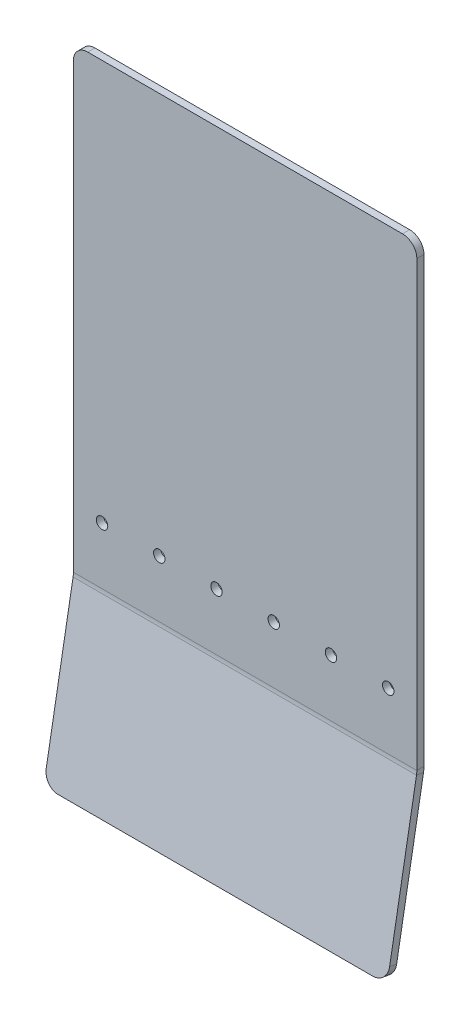
ISO-10303-21;
HEADER;
FILE_DESCRIPTION(('STEP AP214'),'2;1');
FILE_NAME('part.step','',(''),(''),'','','');
FILE_SCHEMA(('AUTOMOTIVE_DESIGN { 1 0 10303 214 1 1 1 1 }'));
ENDSEC;
DATA;
#1=APPLICATION_CONTEXT('core data for automotive mechanical design processes');
#2=APPLICATION_PROTOCOL_DEFINITION('international standard','automotive_design',2000,#1);
#3=PRODUCT_CONTEXT('',#1,'mechanical');
#4=PRODUCT('Part','Part','',(#3));
#5=PRODUCT_RELATED_PRODUCT_CATEGORY('part','',(#4));
#6=PRODUCT_DEFINITION_FORMATION('','',#4);
#7=PRODUCT_DEFINITION_CONTEXT('part definition',#1,'design');
#8=PRODUCT_DEFINITION('design','',#6,#7);
#9=PRODUCT_DEFINITION_SHAPE('','',#8);
#10=(LENGTH_UNIT() NAMED_UNIT(*) SI_UNIT(.MILLI.,.METRE.));
#11=(NAMED_UNIT(*) PLANE_ANGLE_UNIT() SI_UNIT($,.RADIAN.));
#12=(NAMED_UNIT(*) SI_UNIT($,.STERADIAN.) SOLID_ANGLE_UNIT());
#13=UNCERTAINTY_MEASURE_WITH_UNIT(LENGTH_MEASURE(1.E-05),#10,'distance_accuracy_value','');
#14=(GEOMETRIC_REPRESENTATION_CONTEXT(3) GLOBAL_UNCERTAINTY_ASSIGNED_CONTEXT((#13)) GLOBAL_UNIT_ASSIGNED_CONTEXT((#10,
#11,#12)) REPRESENTATION_CONTEXT('',''));
#15=CARTESIAN_POINT('',(0.,0.,0.));
#16=DIRECTION('',(0.,0.,1.));
#17=DIRECTION('',(1.,0.,0.));
#18=AXIS2_PLACEMENT_3D('',#15,#16,#17);
#19=CARTESIAN_POINT('',(152.4,0.,3.175));
#20=DIRECTION('',(-1.,0.,0.));
#21=DIRECTION('',(0.,1.,0.));
#22=AXIS2_PLACEMENT_3D('',#19,#20,#21);
#23=PLANE('',#22);
#24=DIRECTION('',(0.,1.,0.));
#25=VECTOR('',#24,1.);
#26=CARTESIAN_POINT('',(152.4,0.,3.175));
#27=LINE('',#26,#25);
#28=CARTESIAN_POINT('',(152.4,19.1589829192409,3.17500000000003));
#29=VERTEX_POINT('',#28);
#30=CARTESIAN_POINT('',(152.4,215.9,3.175));
#31=VERTEX_POINT('',#30);
#32=EDGE_CURVE('E215',#29,#31,#27,.T.);
#33=ORIENTED_EDGE('',*,*,#32,.F.);
#34=DIRECTION('',(0.,0.,-1.));
#35=VECTOR('',#34,1.);
#36=CARTESIAN_POINT('',(152.4,19.1589829192409,3.17500000000003));
#37=LINE('',#36,#35);
#38=CARTESIAN_POINT('',(152.4,19.1589829192409,0.));
#39=VERTEX_POINT('',#38);
#40=EDGE_CURVE('E193',#29,#39,#37,.T.);
#41=ORIENTED_EDGE('',*,*,#40,.T.);
#42=DIRECTION('',(0.,1.,0.));
#43=VECTOR('',#42,1.);
#44=CARTESIAN_POINT('',(152.4,0.,0.));
#45=LINE('',#44,#43);
#46=CARTESIAN_POINT('',(152.4,215.9,0.));
#47=VERTEX_POINT('',#46);
#48=EDGE_CURVE('E246',#39,#47,#45,.T.);
#49=ORIENTED_EDGE('',*,*,#48,.T.);
#50=DIRECTION('',(0.,0.,1.));
#51=VECTOR('',#50,1.);
#52=CARTESIAN_POINT('',(152.4,215.9,3.175));
#53=LINE('',#52,#51);
#54=EDGE_CURVE('E271',#47,#31,#53,.T.);
#55=ORIENTED_EDGE('',*,*,#54,.T.);
#56=EDGE_LOOP('',(#33,#41,#49,#55));
#57=FACE_BOUND('',#56,.T.);
#58=ADVANCED_FACE('F56',(#57),#23,.F.);
#59=CARTESIAN_POINT('',(0.,0.,3.175));
#60=DIRECTION('',(0.,0.,-1.));
#61=DIRECTION('',(-1.,0.,0.));
#62=AXIS2_PLACEMENT_3D('',#59,#60,#61);
#63=PLANE('',#62);
#64=CARTESIAN_POINT('',(139.7,44.45,3.175));
#65=DIRECTION('',(0.,0.,1.));
#66=DIRECTION('',(1.,0.,0.));
#67=AXIS2_PLACEMENT_3D('',#64,#65,#66);
#68=CIRCLE('',#67,2.54000000000001);
#69=CARTESIAN_POINT('',(142.24,44.45,3.175));
#70=VERTEX_POINT('',#69);
#71=EDGE_CURVE('E235',#70,#70,#68,.T.);
#72=ORIENTED_EDGE('',*,*,#71,.F.);
#73=EDGE_LOOP('',(#72));
#74=FACE_BOUND('',#73,.T.);
#75=CARTESIAN_POINT('',(114.3,44.45,3.175));
#76=DIRECTION('',(0.,0.,1.));
#77=DIRECTION('',(1.,0.,0.));
#78=AXIS2_PLACEMENT_3D('',#75,#76,#77);
#79=CIRCLE('',#78,2.54);
#80=CARTESIAN_POINT('',(116.84,44.45,3.175));
#81=VERTEX_POINT('',#80);
#82=EDGE_CURVE('E232',#81,#81,#79,.T.);
#83=ORIENTED_EDGE('',*,*,#82,.F.);
#84=EDGE_LOOP('',(#83));
#85=FACE_BOUND('',#84,.T.);
#86=CARTESIAN_POINT('',(88.9,44.45,3.175));
#87=DIRECTION('',(0.,0.,1.));
#88=DIRECTION('',(1.,0.,0.));
#89=AXIS2_PLACEMENT_3D('',#86,#87,#88);
#90=CIRCLE('',#89,2.54);
#91=CARTESIAN_POINT('',(91.44,44.45,3.175));
#92=VERTEX_POINT('',#91);
#93=EDGE_CURVE('E229',#92,#92,#90,.T.);
#94=ORIENTED_EDGE('',*,*,#93,.F.);
#95=EDGE_LOOP('',(#94));
#96=FACE_BOUND('',#95,.T.);
#97=CARTESIAN_POINT('',(63.5,44.45,3.175));
#98=DIRECTION('',(0.,0.,1.));
#99=DIRECTION('',(1.,0.,0.));
#100=AXIS2_PLACEMENT_3D('',#97,#98,#99);
#101=CIRCLE('',#100,2.54);
#102=CARTESIAN_POINT('',(66.04,44.45,3.175));
#103=VERTEX_POINT('',#102);
#104=EDGE_CURVE('E226',#103,#103,#101,.T.);
#105=ORIENTED_EDGE('',*,*,#104,.F.);
#106=EDGE_LOOP('',(#105));
#107=FACE_BOUND('',#106,.T.);
#108=CARTESIAN_POINT('',(38.1,44.45,3.175));
#109=DIRECTION('',(0.,0.,1.));
#110=DIRECTION('',(1.,0.,0.));
#111=AXIS2_PLACEMENT_3D('',#108,#109,#110);
#112=CIRCLE('',#111,2.54000000000001);
#113=CARTESIAN_POINT('',(40.64,44.45,3.175));
#114=VERTEX_POINT('',#113);
#115=EDGE_CURVE('E223',#114,#114,#112,.T.);
#116=ORIENTED_EDGE('',*,*,#115,.F.);
#117=EDGE_LOOP('',(#116));
#118=FACE_BOUND('',#117,.T.);
#119=CARTESIAN_POINT('',(12.7,44.45,3.175));
#120=DIRECTION('',(0.,0.,1.));
#121=DIRECTION('',(1.,0.,0.));
#122=AXIS2_PLACEMENT_3D('',#119,#120,#121);
#123=CIRCLE('',#122,2.54);
#124=CARTESIAN_POINT('',(15.24,44.45,3.175));
#125=VERTEX_POINT('',#124);
#126=EDGE_CURVE('E220',#125,#125,#123,.T.);
#127=ORIENTED_EDGE('',*,*,#126,.F.);
#128=EDGE_LOOP('',(#127));
#129=FACE_BOUND('',#128,.T.);
#130=DIRECTION('',(1.,0.,0.));
#131=VECTOR('',#130,1.);
#132=CARTESIAN_POINT('',(152.4,19.1589829192409,3.17500000000003));
#133=LINE('',#132,#131);
#134=CARTESIAN_POINT('',(0.,19.1589829192409,3.175));
#135=VERTEX_POINT('',#134);
#136=EDGE_CURVE('E197',#29,#135,#133,.F.);
#137=ORIENTED_EDGE('',*,*,#136,.F.);
#138=ORIENTED_EDGE('',*,*,#32,.T.);
#139=CARTESIAN_POINT('',(146.05,215.9,3.175));
#140=DIRECTION('',(0.,0.,-1.));
#141=DIRECTION('',(-1.,0.,0.));
#142=AXIS2_PLACEMENT_3D('',#139,#140,#141);
#143=CIRCLE('',#142,6.35);
#144=CARTESIAN_POINT('',(146.05,222.25,3.175));
#145=VERTEX_POINT('',#144);
#146=EDGE_CURVE('E217',#31,#145,#143,.F.);
#147=ORIENTED_EDGE('',*,*,#146,.T.);
#148=DIRECTION('',(-1.,0.,0.));
#149=VECTOR('',#148,1.);
#150=CARTESIAN_POINT('',(0.,222.25,3.175));
#151=LINE('',#150,#149);
#152=CARTESIAN_POINT('',(6.35,222.25,3.175));
#153=VERTEX_POINT('',#152);
#154=EDGE_CURVE('E205',#145,#153,#151,.T.);
#155=ORIENTED_EDGE('',*,*,#154,.T.);
#156=CARTESIAN_POINT('',(6.35,215.9,3.175));
#157=DIRECTION('',(0.,0.,-1.));
#158=DIRECTION('',(-1.,0.,0.));
#159=AXIS2_PLACEMENT_3D('',#156,#157,#158);
#160=CIRCLE('',#159,6.35);
#161=CARTESIAN_POINT('',(0.,215.9,3.175));
#162=VERTEX_POINT('',#161);
#163=EDGE_CURVE('E208',#153,#162,#160,.F.);
#164=ORIENTED_EDGE('',*,*,#163,.T.);
#165=DIRECTION('',(0.,-1.,0.));
#166=VECTOR('',#165,1.);
#167=CARTESIAN_POINT('',(0.,0.,3.175));
#168=LINE('',#167,#166);
#169=EDGE_CURVE('E212',#162,#135,#168,.T.);
#170=ORIENTED_EDGE('',*,*,#169,.T.);
#171=EDGE_LOOP('',(#137,#138,#147,#155,#164,#170));
#172=FACE_BOUND('',#171,.T.);
#173=ADVANCED_FACE('F316',(#74,#85,#96,#107,#118,#129,#172),#63,.F.);
#174=CARTESIAN_POINT('',(0.,0.,0.));
#175=DIRECTION('',(0.,0.,-1.));
#176=DIRECTION('',(-1.,0.,0.));
#177=AXIS2_PLACEMENT_3D('',#174,#175,#176);
#178=PLANE('',#177);
#179=CARTESIAN_POINT('',(12.7,44.45,0.));
#180=DIRECTION('',(0.,0.,1.));
#181=DIRECTION('',(1.,0.,0.));
#182=AXIS2_PLACEMENT_3D('',#179,#180,#181);
#183=CIRCLE('',#182,2.54);
#184=CARTESIAN_POINT('',(15.24,44.45,0.));
#185=VERTEX_POINT('',#184);
#186=EDGE_CURVE('E245',#185,#185,#183,.T.);
#187=ORIENTED_EDGE('',*,*,#186,.T.);
#188=EDGE_LOOP('',(#187));
#189=FACE_BOUND('',#188,.T.);
#190=CARTESIAN_POINT('',(38.1,44.45,0.));
#191=DIRECTION('',(0.,0.,1.));
#192=DIRECTION('',(1.,0.,0.));
#193=AXIS2_PLACEMENT_3D('',#190,#191,#192);
#194=CIRCLE('',#193,2.54000000000001);
#195=CARTESIAN_POINT('',(40.64,44.45,0.));
#196=VERTEX_POINT('',#195);
#197=EDGE_CURVE('E255',#196,#196,#194,.T.);
#198=ORIENTED_EDGE('',*,*,#197,.T.);
#199=EDGE_LOOP('',(#198));
#200=FACE_BOUND('',#199,.T.);
#201=CARTESIAN_POINT('',(63.5,44.45,0.));
#202=DIRECTION('',(0.,0.,1.));
#203=DIRECTION('',(1.,0.,0.));
#204=AXIS2_PLACEMENT_3D('',#201,#202,#203);
#205=CIRCLE('',#204,2.54);
#206=CARTESIAN_POINT('',(66.04,44.45,0.));
#207=VERTEX_POINT('',#206);
#208=EDGE_CURVE('E258',#207,#207,#205,.T.);
#209=ORIENTED_EDGE('',*,*,#208,.T.);
#210=EDGE_LOOP('',(#209));
#211=FACE_BOUND('',#210,.T.);
#212=CARTESIAN_POINT('',(88.9,44.45,0.));
#213=DIRECTION('',(0.,0.,1.));
#214=DIRECTION('',(1.,0.,0.));
#215=AXIS2_PLACEMENT_3D('',#212,#213,#214);
#216=CIRCLE('',#215,2.54);
#217=CARTESIAN_POINT('',(91.44,44.45,0.));
#218=VERTEX_POINT('',#217);
#219=EDGE_CURVE('E261',#218,#218,#216,.T.);
#220=ORIENTED_EDGE('',*,*,#219,.T.);
#221=EDGE_LOOP('',(#220));
#222=FACE_BOUND('',#221,.T.);
#223=CARTESIAN_POINT('',(114.3,44.45,0.));
#224=DIRECTION('',(0.,0.,1.));
#225=DIRECTION('',(1.,0.,0.));
#226=AXIS2_PLACEMENT_3D('',#223,#224,#225);
#227=CIRCLE('',#226,2.54);
#228=CARTESIAN_POINT('',(116.84,44.45,0.));
#229=VERTEX_POINT('',#228);
#230=EDGE_CURVE('E264',#229,#229,#227,.T.);
#231=ORIENTED_EDGE('',*,*,#230,.T.);
#232=EDGE_LOOP('',(#231));
#233=FACE_BOUND('',#232,.T.);
#234=CARTESIAN_POINT('',(139.7,44.45,0.));
#235=DIRECTION('',(0.,0.,1.));
#236=DIRECTION('',(1.,0.,0.));
#237=AXIS2_PLACEMENT_3D('',#234,#235,#236);
#238=CIRCLE('',#237,2.54000000000001);
#239=CARTESIAN_POINT('',(142.24,44.45,0.));
#240=VERTEX_POINT('',#239);
#241=EDGE_CURVE('E209',#240,#240,#238,.T.);
#242=ORIENTED_EDGE('',*,*,#241,.T.);
#243=EDGE_LOOP('',(#242));
#244=FACE_BOUND('',#243,.T.);
#245=ORIENTED_EDGE('',*,*,#48,.F.);
#246=DIRECTION('',(1.,0.,0.));
#247=VECTOR('',#246,1.);
#248=CARTESIAN_POINT('',(152.4,19.1589829192409,0.));
#249=LINE('',#248,#247);
#250=CARTESIAN_POINT('',(0.,19.158982919241,0.));
#251=VERTEX_POINT('',#250);
#252=EDGE_CURVE('E154',#39,#251,#249,.F.);
#253=ORIENTED_EDGE('',*,*,#252,.T.);
#254=DIRECTION('',(0.,1.,0.));
#255=VECTOR('',#254,1.);
#256=CARTESIAN_POINT('',(0.,0.,0.));
#257=LINE('',#256,#255);
#258=CARTESIAN_POINT('',(0.,215.9,0.));
#259=VERTEX_POINT('',#258);
#260=EDGE_CURVE('E248',#259,#251,#257,.F.);
#261=ORIENTED_EDGE('',*,*,#260,.F.);
#262=CARTESIAN_POINT('',(6.35,215.9,0.));
#263=DIRECTION('',(0.,0.,-1.));
#264=DIRECTION('',(-1.,0.,0.));
#265=AXIS2_PLACEMENT_3D('',#262,#263,#264);
#266=CIRCLE('',#265,6.35);
#267=CARTESIAN_POINT('',(6.35,222.25,0.));
#268=VERTEX_POINT('',#267);
#269=EDGE_CURVE('E241',#268,#259,#266,.F.);
#270=ORIENTED_EDGE('',*,*,#269,.F.);
#271=DIRECTION('',(-1.,0.,0.));
#272=VECTOR('',#271,1.);
#273=CARTESIAN_POINT('',(0.,222.25,0.));
#274=LINE('',#273,#272);
#275=CARTESIAN_POINT('',(146.05,222.25,0.));
#276=VERTEX_POINT('',#275);
#277=EDGE_CURVE('E203',#276,#268,#274,.T.);
#278=ORIENTED_EDGE('',*,*,#277,.F.);
#279=CARTESIAN_POINT('',(146.05,215.9,0.));
#280=DIRECTION('',(0.,0.,-1.));
#281=DIRECTION('',(-1.,0.,0.));
#282=AXIS2_PLACEMENT_3D('',#279,#280,#281);
#283=CIRCLE('',#282,6.35);
#284=EDGE_CURVE('E242',#47,#276,#283,.F.);
#285=ORIENTED_EDGE('',*,*,#284,.F.);
#286=EDGE_LOOP('',(#245,#253,#261,#270,#278,#285));
#287=FACE_BOUND('',#286,.T.);
#288=ADVANCED_FACE('F325',(#189,#200,#211,#222,#233,#244,#287),#178,.T.);
#289=CARTESIAN_POINT('',(0.,0.,3.175));
#290=DIRECTION('',(1.,0.,0.));
#291=DIRECTION('',(0.,-1.,0.));
#292=AXIS2_PLACEMENT_3D('',#289,#290,#291);
#293=PLANE('',#292);
#294=DIRECTION('',(0.,0.,-1.));
#295=VECTOR('',#294,1.);
#296=CARTESIAN_POINT('',(0.,19.1589829192409,3.175));
#297=LINE('',#296,#295);
#298=EDGE_CURVE('E200',#135,#251,#297,.T.);
#299=ORIENTED_EDGE('',*,*,#298,.F.);
#300=ORIENTED_EDGE('',*,*,#169,.F.);
#301=DIRECTION('',(0.,0.,1.));
#302=VECTOR('',#301,1.);
#303=CARTESIAN_POINT('',(0.,215.9,3.175));
#304=LINE('',#303,#302);
#305=EDGE_CURVE('E274',#259,#162,#304,.T.);
#306=ORIENTED_EDGE('',*,*,#305,.F.);
#307=ORIENTED_EDGE('',*,*,#260,.T.);
#308=EDGE_LOOP('',(#299,#300,#306,#307));
#309=FACE_BOUND('',#308,.T.);
#310=ADVANCED_FACE('F313',(#309),#293,.F.);
#311=CARTESIAN_POINT('',(146.05,215.9,3.175));
#312=DIRECTION('',(0.,0.,-1.));
#313=DIRECTION('',(-1.,0.,0.));
#314=AXIS2_PLACEMENT_3D('',#311,#312,#313);
#315=CYLINDRICAL_SURFACE('',#314,6.35);
#316=ORIENTED_EDGE('',*,*,#54,.F.);
#317=ORIENTED_EDGE('',*,*,#284,.T.);
#318=DIRECTION('',(0.,0.,1.));
#319=VECTOR('',#318,1.);
#320=CARTESIAN_POINT('',(146.05,222.25,3.175));
#321=LINE('',#320,#319);
#322=EDGE_CURVE('E269',#276,#145,#321,.T.);
#323=ORIENTED_EDGE('',*,*,#322,.T.);
#324=ORIENTED_EDGE('',*,*,#146,.F.);
#325=EDGE_LOOP('',(#316,#317,#323,#324));
#326=FACE_BOUND('',#325,.T.);
#327=ADVANCED_FACE('F332',(#326),#315,.T.);
#328=CARTESIAN_POINT('',(0.,222.25,3.175));
#329=DIRECTION('',(0.,-1.,0.));
#330=DIRECTION('',(-1.,0.,0.));
#331=AXIS2_PLACEMENT_3D('',#328,#329,#330);
#332=PLANE('',#331);
#333=ORIENTED_EDGE('',*,*,#322,.F.);
#334=ORIENTED_EDGE('',*,*,#277,.T.);
#335=DIRECTION('',(0.,0.,1.));
#336=VECTOR('',#335,1.);
#337=CARTESIAN_POINT('',(6.35,222.25,3.175));
#338=LINE('',#337,#336);
#339=EDGE_CURVE('E238',#268,#153,#338,.T.);
#340=ORIENTED_EDGE('',*,*,#339,.T.);
#341=ORIENTED_EDGE('',*,*,#154,.F.);
#342=EDGE_LOOP('',(#333,#334,#340,#341));
#343=FACE_BOUND('',#342,.T.);
#344=ADVANCED_FACE('F334',(#343),#332,.F.);
#345=CARTESIAN_POINT('',(6.35,215.9,3.175));
#346=DIRECTION('',(0.,0.,-1.));
#347=DIRECTION('',(-1.,0.,0.));
#348=AXIS2_PLACEMENT_3D('',#345,#346,#347);
#349=CYLINDRICAL_SURFACE('',#348,6.35);
#350=ORIENTED_EDGE('',*,*,#269,.T.);
#351=ORIENTED_EDGE('',*,*,#305,.T.);
#352=ORIENTED_EDGE('',*,*,#163,.F.);
#353=ORIENTED_EDGE('',*,*,#339,.F.);
#354=EDGE_LOOP('',(#350,#351,#352,#353));
#355=FACE_BOUND('',#354,.T.);
#356=ADVANCED_FACE('F321',(#355),#349,.T.);
#357=CARTESIAN_POINT('',(12.7,44.45,3.175));
#358=DIRECTION('',(0.,0.,-1.));
#359=DIRECTION('',(-1.,0.,0.));
#360=AXIS2_PLACEMENT_3D('',#357,#358,#359);
#361=CYLINDRICAL_SURFACE('',#360,2.54);
#362=ORIENTED_EDGE('',*,*,#126,.T.);
#363=EDGE_LOOP('',(#362));
#364=FACE_BOUND('',#363,.T.);
#365=ORIENTED_EDGE('',*,*,#186,.F.);
#366=EDGE_LOOP('',(#365));
#367=FACE_BOUND('',#366,.T.);
#368=ADVANCED_FACE('F341',(#364,#367),#361,.F.);
#369=CARTESIAN_POINT('',(38.1,44.45,3.175));
#370=DIRECTION('',(0.,0.,-1.));
#371=DIRECTION('',(-1.,0.,0.));
#372=AXIS2_PLACEMENT_3D('',#369,#370,#371);
#373=CYLINDRICAL_SURFACE('',#372,2.54000000000001);
#374=ORIENTED_EDGE('',*,*,#115,.T.);
#375=EDGE_LOOP('',(#374));
#376=FACE_BOUND('',#375,.T.);
#377=ORIENTED_EDGE('',*,*,#197,.F.);
#378=EDGE_LOOP('',(#377));
#379=FACE_BOUND('',#378,.T.);
#380=ADVANCED_FACE('F357',(#376,#379),#373,.F.);
#381=CARTESIAN_POINT('',(63.5,44.45,3.175));
#382=DIRECTION('',(0.,0.,-1.));
#383=DIRECTION('',(-1.,0.,0.));
#384=AXIS2_PLACEMENT_3D('',#381,#382,#383);
#385=CYLINDRICAL_SURFACE('',#384,2.54);
#386=ORIENTED_EDGE('',*,*,#104,.T.);
#387=EDGE_LOOP('',(#386));
#388=FACE_BOUND('',#387,.T.);
#389=ORIENTED_EDGE('',*,*,#208,.F.);
#390=EDGE_LOOP('',(#389));
#391=FACE_BOUND('',#390,.T.);
#392=ADVANCED_FACE('F361',(#388,#391),#385,.F.);
#393=CARTESIAN_POINT('',(88.9,44.45,3.175));
#394=DIRECTION('',(0.,0.,-1.));
#395=DIRECTION('',(-1.,0.,0.));
#396=AXIS2_PLACEMENT_3D('',#393,#394,#395);
#397=CYLINDRICAL_SURFACE('',#396,2.54);
#398=ORIENTED_EDGE('',*,*,#93,.T.);
#399=EDGE_LOOP('',(#398));
#400=FACE_BOUND('',#399,.T.);
#401=ORIENTED_EDGE('',*,*,#219,.F.);
#402=EDGE_LOOP('',(#401));
#403=FACE_BOUND('',#402,.T.);
#404=ADVANCED_FACE('F365',(#400,#403),#397,.F.);
#405=CARTESIAN_POINT('',(114.3,44.45,3.175));
#406=DIRECTION('',(0.,0.,-1.));
#407=DIRECTION('',(-1.,0.,0.));
#408=AXIS2_PLACEMENT_3D('',#405,#406,#407);
#409=CYLINDRICAL_SURFACE('',#408,2.54);
#410=ORIENTED_EDGE('',*,*,#82,.T.);
#411=EDGE_LOOP('',(#410));
#412=FACE_BOUND('',#411,.T.);
#413=ORIENTED_EDGE('',*,*,#230,.F.);
#414=EDGE_LOOP('',(#413));
#415=FACE_BOUND('',#414,.T.);
#416=ADVANCED_FACE('F369',(#412,#415),#409,.F.);
#417=CARTESIAN_POINT('',(139.7,44.45,3.175));
#418=DIRECTION('',(0.,0.,-1.));
#419=DIRECTION('',(-1.,0.,0.));
#420=AXIS2_PLACEMENT_3D('',#417,#418,#419);
#421=CYLINDRICAL_SURFACE('',#420,2.54000000000001);
#422=ORIENTED_EDGE('',*,*,#71,.T.);
#423=EDGE_LOOP('',(#422));
#424=FACE_BOUND('',#423,.T.);
#425=ORIENTED_EDGE('',*,*,#241,.F.);
#426=EDGE_LOOP('',(#425));
#427=FACE_BOUND('',#426,.T.);
#428=ADVANCED_FACE('F373',(#424,#427),#421,.F.);
#429=CARTESIAN_POINT('',(0.,19.1589829192409,13.175));
#430=DIRECTION('',(-1.,0.,0.));
#431=DIRECTION('',(0.,0.,1.));
#432=AXIS2_PLACEMENT_3D('',#429,#430,#431);
#433=PLANE('',#432);
#434=DIRECTION('',(0.,0.173648177666924,0.984807753012209));
#435=VECTOR('',#434,1.);
#436=CARTESIAN_POINT('',(0.,16.8711681784792,0.200157854064144));
#437=LINE('',#436,#435);
#438=CARTESIAN_POINT('',(0.,17.4225011425717,3.32692246987791));
#439=VERTEX_POINT('',#438);
#440=CARTESIAN_POINT('',(0.,16.8711681784792,0.200157854064145));
#441=VERTEX_POINT('',#440);
#442=EDGE_CURVE('E188',#439,#441,#437,.F.);
#443=ORIENTED_EDGE('',*,*,#442,.F.);
#444=CARTESIAN_POINT('',(0.,19.1589829192409,13.175));
#445=DIRECTION('',(1.,0.,0.));
#446=DIRECTION('',(0.,0.,-1.));
#447=AXIS2_PLACEMENT_3D('',#444,#445,#446);
#448=CIRCLE('',#447,10.);
#449=EDGE_CURVE('E157',#135,#439,#448,.F.);
#450=ORIENTED_EDGE('',*,*,#449,.F.);
#451=ORIENTED_EDGE('',*,*,#298,.T.);
#452=CARTESIAN_POINT('',(0.,19.1589829192409,13.175));
#453=DIRECTION('',(1.,0.,0.));
#454=DIRECTION('',(0.,0.,-1.));
#455=AXIS2_PLACEMENT_3D('',#452,#453,#454);
#456=CIRCLE('',#455,13.175);
#457=EDGE_CURVE('E192',#251,#441,#456,.F.);
#458=ORIENTED_EDGE('',*,*,#457,.T.);
#459=EDGE_LOOP('',(#443,#450,#451,#458));
#460=FACE_BOUND('',#459,.T.);
#461=ADVANCED_FACE('F310',(#460),#433,.T.);
#462=CARTESIAN_POINT('',(152.4,19.1589829192409,13.175));
#463=DIRECTION('',(-1.,0.,0.));
#464=DIRECTION('',(0.,0.,1.));
#465=AXIS2_PLACEMENT_3D('',#462,#463,#464);
#466=PLANE('',#465);
#467=CARTESIAN_POINT('',(152.4,19.1589829192409,13.175));
#468=DIRECTION('',(1.,0.,0.));
#469=DIRECTION('',(0.,0.,-1.));
#470=AXIS2_PLACEMENT_3D('',#467,#468,#469);
#471=CIRCLE('',#470,10.);
#472=CARTESIAN_POINT('',(152.4,17.4225011425717,3.32692246987793));
#473=VERTEX_POINT('',#472);
#474=EDGE_CURVE('E164',#473,#29,#471,.T.);
#475=ORIENTED_EDGE('',*,*,#474,.F.);
#476=DIRECTION('',(0.,0.173648177666924,0.984807753012209));
#477=VECTOR('',#476,1.);
#478=CARTESIAN_POINT('',(152.4,17.4225011425717,3.32692246987791));
#479=LINE('',#478,#477);
#480=CARTESIAN_POINT('',(152.4,16.8711681784792,0.200157854064146));
#481=VERTEX_POINT('',#480);
#482=EDGE_CURVE('E161',#473,#481,#479,.F.);
#483=ORIENTED_EDGE('',*,*,#482,.T.);
#484=CARTESIAN_POINT('',(152.4,19.1589829192409,13.175));
#485=DIRECTION('',(1.,0.,0.));
#486=DIRECTION('',(0.,0.,-1.));
#487=AXIS2_PLACEMENT_3D('',#484,#485,#486);
#488=CIRCLE('',#487,13.175);
#489=EDGE_CURVE('E147',#481,#39,#488,.T.);
#490=ORIENTED_EDGE('',*,*,#489,.T.);
#491=ORIENTED_EDGE('',*,*,#40,.F.);
#492=EDGE_LOOP('',(#475,#483,#490,#491));
#493=FACE_BOUND('',#492,.T.);
#494=ADVANCED_FACE('F162',(#493),#466,.F.);
#495=CARTESIAN_POINT('',(152.4,19.1589829192409,13.175));
#496=DIRECTION('',(1.,0.,0.));
#497=DIRECTION('',(0.,-0.173648177666924,-0.984807753012209));
#498=AXIS2_PLACEMENT_3D('',#495,#496,#497);
#499=CYLINDRICAL_SURFACE('',#498,13.175);
#500=ORIENTED_EDGE('',*,*,#252,.F.);
#501=ORIENTED_EDGE('',*,*,#489,.F.);
#502=DIRECTION('',(1.,0.,0.));
#503=VECTOR('',#502,1.);
#504=CARTESIAN_POINT('',(0.,16.8711681784792,0.200157854064146));
#505=LINE('',#504,#503);
#506=EDGE_CURVE('E151',#481,#441,#505,.F.);
#507=ORIENTED_EDGE('',*,*,#506,.T.);
#508=ORIENTED_EDGE('',*,*,#457,.F.);
#509=EDGE_LOOP('',(#500,#501,#507,#508));
#510=FACE_BOUND('',#509,.T.);
#511=ADVANCED_FACE('F149',(#510),#499,.T.);
#512=CARTESIAN_POINT('',(152.4,19.1589829192409,13.175));
#513=DIRECTION('',(1.,0.,0.));
#514=DIRECTION('',(0.,-0.173648177666924,-0.984807753012209));
#515=AXIS2_PLACEMENT_3D('',#512,#513,#514);
#516=CYLINDRICAL_SURFACE('',#515,10.);
#517=ORIENTED_EDGE('',*,*,#136,.T.);
#518=ORIENTED_EDGE('',*,*,#449,.T.);
#519=DIRECTION('',(1.,0.,0.));
#520=VECTOR('',#519,1.);
#521=CARTESIAN_POINT('',(0.,17.4225011425717,3.32692246987791));
#522=LINE('',#521,#520);
#523=EDGE_CURVE('E166',#439,#473,#522,.T.);
#524=ORIENTED_EDGE('',*,*,#523,.T.);
#525=ORIENTED_EDGE('',*,*,#474,.T.);
#526=EDGE_LOOP('',(#517,#518,#524,#525));
#527=FACE_BOUND('',#526,.T.);
#528=ADVANCED_FACE('F305',(#527),#516,.F.);
#529=CARTESIAN_POINT('',(152.4,-57.0360310022434,13.2319911382196));
#530=DIRECTION('',(-1.,0.,0.));
#531=DIRECTION('',(0.,-1.,0.));
#532=AXIS2_PLACEMENT_3D('',#529,#530,#531);
#533=PLANE('',#532);
#534=DIRECTION('',(0.,0.984807753012209,-0.173648177666924));
#535=VECTOR('',#534,1.);
#536=CARTESIAN_POINT('',(152.4,-56.4846980381509,16.3587557540333));
#537=LINE('',#536,#535);
#538=CARTESIAN_POINT('',(152.4,-50.2311688065234,15.2560898258484));
#539=VERTEX_POINT('',#538);
#540=EDGE_CURVE('E174',#473,#539,#537,.F.);
#541=ORIENTED_EDGE('',*,*,#540,.T.);
#542=DIRECTION('',(0.,0.173648177666924,0.984807753012209));
#543=VECTOR('',#542,1.);
#544=CARTESIAN_POINT('',(152.4,-50.7825017706159,12.1293252100346));
#545=LINE('',#544,#543);
#546=CARTESIAN_POINT('',(152.4,-50.7825017706159,12.1293252100346));
#547=VERTEX_POINT('',#546);
#548=EDGE_CURVE('E13',#539,#547,#545,.F.);
#549=ORIENTED_EDGE('',*,*,#548,.T.);
#550=DIRECTION('',(0.,-0.984807753012209,0.173648177666924));
#551=VECTOR('',#550,1.);
#552=CARTESIAN_POINT('',(152.4,18.2757202974188,-0.0475025803161352));
#553=LINE('',#552,#551);
#554=EDGE_CURVE('E170',#481,#547,#553,.T.);
#555=ORIENTED_EDGE('',*,*,#554,.F.);
#556=ORIENTED_EDGE('',*,*,#482,.F.);
#557=EDGE_LOOP('',(#541,#549,#555,#556));
#558=FACE_BOUND('',#557,.T.);
#559=ADVANCED_FACE('F176',(#558),#533,.F.);
#560=CARTESIAN_POINT('',(0.,17.7327633198893,0.048235384186236));
#561=DIRECTION('',(1.,0.,0.));
#562=DIRECTION('',(0.,0.,-1.));
#563=AXIS2_PLACEMENT_3D('',#560,#561,#562);
#564=PLANE('',#563);
#565=DIRECTION('',(0.,0.984807753012209,-0.173648177666924));
#566=VECTOR('',#565,1.);
#567=CARTESIAN_POINT('',(0.,18.2757202974187,-0.0475025803161255));
#568=LINE('',#567,#566);
#569=CARTESIAN_POINT('',(0.,-50.7825017706159,12.1293252100346));
#570=VERTEX_POINT('',#569);
#571=EDGE_CURVE('E173',#570,#441,#568,.T.);
#572=ORIENTED_EDGE('',*,*,#571,.F.);
#573=DIRECTION('',(0.,0.173648177666924,0.984807753012209));
#574=VECTOR('',#573,1.);
#575=CARTESIAN_POINT('',(0.,-50.7825017706159,12.1293252100346));
#576=LINE('',#575,#574);
#577=CARTESIAN_POINT('',(0.,-50.2311688065234,15.2560898258484));
#578=VERTEX_POINT('',#577);
#579=EDGE_CURVE('E276',#570,#578,#576,.T.);
#580=ORIENTED_EDGE('',*,*,#579,.T.);
#581=DIRECTION('',(0.,-0.984807753012209,0.173648177666924));
#582=VECTOR('',#581,1.);
#583=CARTESIAN_POINT('',(0.,18.2840962839817,3.175));
#584=LINE('',#583,#582);
#585=EDGE_CURVE('E178',#578,#439,#584,.F.);
#586=ORIENTED_EDGE('',*,*,#585,.T.);
#587=ORIENTED_EDGE('',*,*,#442,.T.);
#588=EDGE_LOOP('',(#572,#580,#586,#587));
#589=FACE_BOUND('',#588,.T.);
#590=ADVANCED_FACE('F293',(#589),#564,.F.);
#591=CARTESIAN_POINT('',(0.,18.2757202974187,-0.0475025803161255));
#592=DIRECTION('',(0.,0.173648177666924,0.984807753012209));
#593=DIRECTION('',(0.,-0.984807753012209,0.173648177666924));
#594=AXIS2_PLACEMENT_3D('',#591,#592,#593);
#595=PLANE('',#594);
#596=DIRECTION('',(-1.,0.,0.));
#597=VECTOR('',#596,1.);
#598=CARTESIAN_POINT('',(0.,-57.0360310022434,13.2319911382196));
#599=LINE('',#598,#597);
#600=CARTESIAN_POINT('',(146.05,-57.0360310022434,13.2319911382196));
#601=VERTEX_POINT('',#600);
#602=CARTESIAN_POINT('',(6.35,-57.0360310022434,13.2319911382196));
#603=VERTEX_POINT('',#602);
#604=EDGE_CURVE('E177',#601,#603,#599,.T.);
#605=ORIENTED_EDGE('',*,*,#604,.T.);
#606=CARTESIAN_POINT('',(6.35,-50.7825017706159,12.1293252100346));
#607=DIRECTION('',(0.,0.173648177666924,0.984807753012209));
#608=DIRECTION('',(0.,-0.984807753012209,0.173648177666924));
#609=AXIS2_PLACEMENT_3D('',#606,#607,#608);
#610=CIRCLE('',#609,6.35);
#611=EDGE_CURVE('E64',#603,#570,#610,.F.);
#612=ORIENTED_EDGE('',*,*,#611,.T.);
#613=ORIENTED_EDGE('',*,*,#571,.T.);
#614=ORIENTED_EDGE('',*,*,#506,.F.);
#615=ORIENTED_EDGE('',*,*,#554,.T.);
#616=CARTESIAN_POINT('',(146.05,-50.7825017706159,12.1293252100346));
#617=DIRECTION('',(0.,0.173648177666924,0.984807753012209));
#618=DIRECTION('',(0.,-0.984807753012209,0.173648177666924));
#619=AXIS2_PLACEMENT_3D('',#616,#617,#618);
#620=CIRCLE('',#619,6.35);
#621=EDGE_CURVE('E288',#547,#601,#620,.F.);
#622=ORIENTED_EDGE('',*,*,#621,.T.);
#623=EDGE_LOOP('',(#605,#612,#613,#614,#615,#622));
#624=FACE_BOUND('',#623,.T.);
#625=ADVANCED_FACE('F169',(#624),#595,.F.);
#626=CARTESIAN_POINT('',(0.,18.8270532615112,3.07926203549764));
#627=DIRECTION('',(0.,0.173648177666924,0.984807753012209));
#628=DIRECTION('',(0.,-0.984807753012209,0.173648177666924));
#629=AXIS2_PLACEMENT_3D('',#626,#627,#628);
#630=PLANE('',#629);
#631=ORIENTED_EDGE('',*,*,#585,.F.);
#632=CARTESIAN_POINT('',(6.35,-50.2311688065234,15.2560898258484));
#633=DIRECTION('',(0.,0.173648177666924,0.984807753012209));
#634=DIRECTION('',(0.,-0.984807753012209,0.173648177666924));
#635=AXIS2_PLACEMENT_3D('',#632,#633,#634);
#636=CIRCLE('',#635,6.35);
#637=CARTESIAN_POINT('',(6.35,-56.4846980381509,16.3587557540333));
#638=VERTEX_POINT('',#637);
#639=EDGE_CURVE('E282',#578,#638,#636,.T.);
#640=ORIENTED_EDGE('',*,*,#639,.T.);
#641=DIRECTION('',(1.,0.,0.));
#642=VECTOR('',#641,1.);
#643=CARTESIAN_POINT('',(0.,-56.4846980381509,16.3587557540333));
#644=LINE('',#643,#642);
#645=CARTESIAN_POINT('',(146.05,-56.4846980381509,16.3587557540333));
#646=VERTEX_POINT('',#645);
#647=EDGE_CURVE('E181',#646,#638,#644,.F.);
#648=ORIENTED_EDGE('',*,*,#647,.F.);
#649=CARTESIAN_POINT('',(146.05,-50.2311688065234,15.2560898258484));
#650=DIRECTION('',(0.,0.173648177666924,0.984807753012209));
#651=DIRECTION('',(0.,-0.984807753012209,0.173648177666924));
#652=AXIS2_PLACEMENT_3D('',#649,#650,#651);
#653=CIRCLE('',#652,6.35);
#654=EDGE_CURVE('E280',#646,#539,#653,.T.);
#655=ORIENTED_EDGE('',*,*,#654,.T.);
#656=ORIENTED_EDGE('',*,*,#540,.F.);
#657=ORIENTED_EDGE('',*,*,#523,.F.);
#658=EDGE_LOOP('',(#631,#640,#648,#655,#656,#657));
#659=FACE_BOUND('',#658,.T.);
#660=ADVANCED_FACE('F299',(#659),#630,.T.);
#661=CARTESIAN_POINT('',(0.,-57.0360310022434,13.2319911382196));
#662=DIRECTION('',(0.,0.984807753012209,-0.173648177666924));
#663=DIRECTION('',(0.,0.173648177666924,0.984807753012209));
#664=AXIS2_PLACEMENT_3D('',#661,#662,#663);
#665=PLANE('',#664);
#666=ORIENTED_EDGE('',*,*,#647,.T.);
#667=DIRECTION('',(0.,0.173648177666924,0.984807753012209));
#668=VECTOR('',#667,1.);
#669=CARTESIAN_POINT('',(6.35,-57.0360310022434,13.2319911382196));
#670=LINE('',#669,#668);
#671=EDGE_CURVE('E77',#638,#603,#670,.F.);
#672=ORIENTED_EDGE('',*,*,#671,.T.);
#673=ORIENTED_EDGE('',*,*,#604,.F.);
#674=DIRECTION('',(0.,0.173648177666924,0.984807753012209));
#675=VECTOR('',#674,1.);
#676=CARTESIAN_POINT('',(146.05,-57.0360310022434,13.2319911382196));
#677=LINE('',#676,#675);
#678=EDGE_CURVE('E284',#601,#646,#677,.T.);
#679=ORIENTED_EDGE('',*,*,#678,.T.);
#680=EDGE_LOOP('',(#666,#672,#673,#679));
#681=FACE_BOUND('',#680,.T.);
#682=ADVANCED_FACE('F301',(#681),#665,.F.);
#683=CARTESIAN_POINT('',(6.35,-50.7825017706159,12.1293252100346));
#684=DIRECTION('',(0.,0.173648177666924,0.984807753012209));
#685=DIRECTION('',(0.,-0.984807753012209,0.173648177666924));
#686=AXIS2_PLACEMENT_3D('',#683,#684,#685);
#687=CYLINDRICAL_SURFACE('',#686,6.35);
#688=ORIENTED_EDGE('',*,*,#611,.F.);
#689=ORIENTED_EDGE('',*,*,#671,.F.);
#690=ORIENTED_EDGE('',*,*,#639,.F.);
#691=ORIENTED_EDGE('',*,*,#579,.F.);
#692=EDGE_LOOP('',(#688,#689,#690,#691));
#693=FACE_BOUND('',#692,.T.);
#694=ADVANCED_FACE('F296',(#693),#687,.T.);
#695=CARTESIAN_POINT('',(146.05,-50.7825017706159,12.1293252100346));
#696=DIRECTION('',(0.,0.173648177666924,0.984807753012209));
#697=DIRECTION('',(0.,-0.984807753012209,0.173648177666924));
#698=AXIS2_PLACEMENT_3D('',#695,#696,#697);
#699=CYLINDRICAL_SURFACE('',#698,6.35);
#700=ORIENTED_EDGE('',*,*,#621,.F.);
#701=ORIENTED_EDGE('',*,*,#548,.F.);
#702=ORIENTED_EDGE('',*,*,#654,.F.);
#703=ORIENTED_EDGE('',*,*,#678,.F.);
#704=EDGE_LOOP('',(#700,#701,#702,#703));
#705=FACE_BOUND('',#704,.T.);
#706=ADVANCED_FACE('F58',(#705),#699,.T.);
#707=CLOSED_SHELL('',(#58,#173,#288,#310,#327,#344,#356,#368,#380,#392,#404,#416,#428,#461,#494,
#511,#528,#559,#590,#625,#660,#682,#694,#706));
#708=MANIFOLD_SOLID_BREP('B2',#707);
#709=ADVANCED_BREP_SHAPE_REPRESENTATION('',(#18,#708),#14);
#710=SHAPE_DEFINITION_REPRESENTATION(#9,#709);
ENDSEC;
END-ISO-10303-21;
